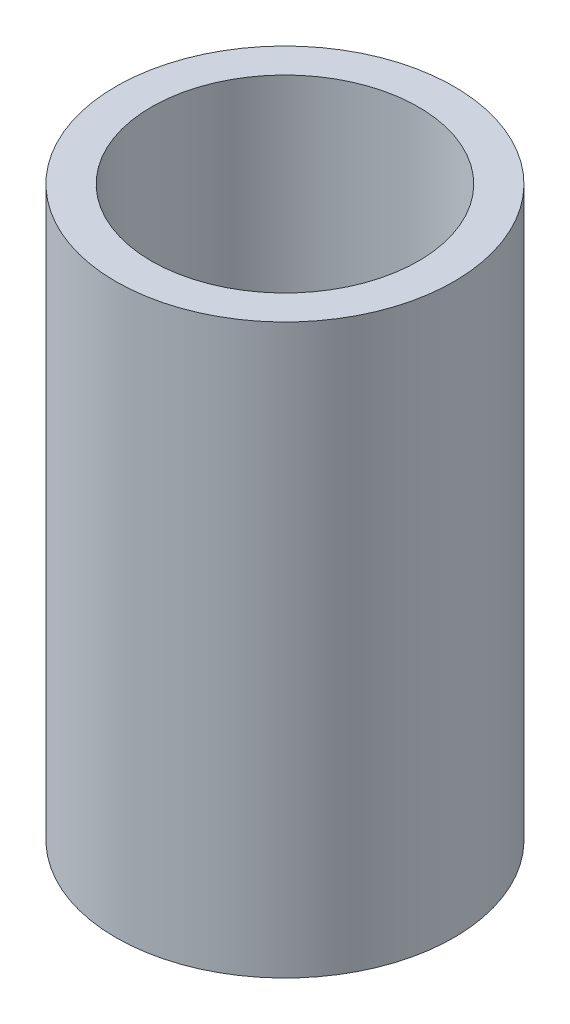
ISO-10303-21;
HEADER;
FILE_DESCRIPTION(('STEP AP214'),'2;1');
FILE_NAME('part.step','',(''),(''),'','','');
FILE_SCHEMA(('AUTOMOTIVE_DESIGN { 1 0 10303 214 1 1 1 1 }'));
ENDSEC;
DATA;
#1=APPLICATION_CONTEXT('core data for automotive mechanical design processes');
#2=APPLICATION_PROTOCOL_DEFINITION('international standard','automotive_design',2000,#1);
#3=PRODUCT_CONTEXT('',#1,'mechanical');
#4=PRODUCT('Part','Part','',(#3));
#5=PRODUCT_RELATED_PRODUCT_CATEGORY('part','',(#4));
#6=PRODUCT_DEFINITION_FORMATION('','',#4);
#7=PRODUCT_DEFINITION_CONTEXT('part definition',#1,'design');
#8=PRODUCT_DEFINITION('design','',#6,#7);
#9=PRODUCT_DEFINITION_SHAPE('','',#8);
#10=(LENGTH_UNIT() NAMED_UNIT(*) SI_UNIT(.MILLI.,.METRE.));
#11=(NAMED_UNIT(*) PLANE_ANGLE_UNIT() SI_UNIT($,.RADIAN.));
#12=(NAMED_UNIT(*) SI_UNIT($,.STERADIAN.) SOLID_ANGLE_UNIT());
#13=UNCERTAINTY_MEASURE_WITH_UNIT(LENGTH_MEASURE(1.E-05),#10,'distance_accuracy_value','');
#14=(GEOMETRIC_REPRESENTATION_CONTEXT(3) GLOBAL_UNCERTAINTY_ASSIGNED_CONTEXT((#13)) GLOBAL_UNIT_ASSIGNED_CONTEXT((#10,
#11,#12)) REPRESENTATION_CONTEXT('',''));
#15=CARTESIAN_POINT('',(0.,0.,0.));
#16=DIRECTION('',(0.,0.,1.));
#17=DIRECTION('',(1.,0.,0.));
#18=AXIS2_PLACEMENT_3D('',#15,#16,#17);
#19=CARTESIAN_POINT('',(0.,10.16,0.));
#20=DIRECTION('',(0.,1.,0.));
#21=DIRECTION('',(0.,0.,1.));
#22=AXIS2_PLACEMENT_3D('',#19,#20,#21);
#23=PLANE('',#22);
#24=CARTESIAN_POINT('',(0.,10.16,0.));
#25=DIRECTION('',(0.,1.,0.));
#26=DIRECTION('',(0.,0.,1.));
#27=AXIS2_PLACEMENT_3D('',#24,#25,#26);
#28=CIRCLE('',#27,3.0226);
#29=CARTESIAN_POINT('',(0.,10.16,3.0226));
#30=VERTEX_POINT('',#29);
#31=EDGE_CURVE('E10',#30,#30,#28,.T.);
#32=ORIENTED_EDGE('',*,*,#31,.T.);
#33=EDGE_LOOP('',(#32));
#34=FACE_BOUND('',#33,.T.);
#35=CARTESIAN_POINT('',(0.,10.16,0.));
#36=DIRECTION('',(0.,1.,0.));
#37=DIRECTION('',(0.,0.,1.));
#38=AXIS2_PLACEMENT_3D('',#35,#36,#37);
#39=CIRCLE('',#38,2.3876);
#40=CARTESIAN_POINT('',(0.,10.16,2.3876));
#41=VERTEX_POINT('',#40);
#42=EDGE_CURVE('E43',#41,#41,#39,.T.);
#43=ORIENTED_EDGE('',*,*,#42,.F.);
#44=EDGE_LOOP('',(#43));
#45=FACE_BOUND('',#44,.T.);
#46=ADVANCED_FACE('F32',(#34,#45),#23,.T.);
#47=CARTESIAN_POINT('',(0.,0.,0.));
#48=DIRECTION('',(0.,1.,0.));
#49=DIRECTION('',(0.,0.,1.));
#50=AXIS2_PLACEMENT_3D('',#47,#48,#49);
#51=PLANE('',#50);
#52=CARTESIAN_POINT('',(0.,0.,0.));
#53=DIRECTION('',(0.,1.,0.));
#54=DIRECTION('',(0.,0.,1.));
#55=AXIS2_PLACEMENT_3D('',#52,#53,#54);
#56=CIRCLE('',#55,3.0226);
#57=CARTESIAN_POINT('',(0.,0.,3.0226));
#58=VERTEX_POINT('',#57);
#59=EDGE_CURVE('E36',#58,#58,#56,.T.);
#60=ORIENTED_EDGE('',*,*,#59,.F.);
#61=EDGE_LOOP('',(#60));
#62=FACE_BOUND('',#61,.T.);
#63=CARTESIAN_POINT('',(0.,0.,0.));
#64=DIRECTION('',(0.,1.,0.));
#65=DIRECTION('',(0.,0.,1.));
#66=AXIS2_PLACEMENT_3D('',#63,#64,#65);
#67=CIRCLE('',#66,2.3876);
#68=CARTESIAN_POINT('',(0.,0.,2.3876));
#69=VERTEX_POINT('',#68);
#70=EDGE_CURVE('E45',#69,#69,#67,.T.);
#71=ORIENTED_EDGE('',*,*,#70,.T.);
#72=EDGE_LOOP('',(#71));
#73=FACE_BOUND('',#72,.T.);
#74=ADVANCED_FACE('F55',(#62,#73),#51,.F.);
#75=CARTESIAN_POINT('',(0.,10.16,0.));
#76=DIRECTION('',(0.,-1.,0.));
#77=DIRECTION('',(0.,0.,-1.));
#78=AXIS2_PLACEMENT_3D('',#75,#76,#77);
#79=CYLINDRICAL_SURFACE('',#78,3.0226);
#80=ORIENTED_EDGE('',*,*,#31,.F.);
#81=EDGE_LOOP('',(#80));
#82=FACE_BOUND('',#81,.T.);
#83=ORIENTED_EDGE('',*,*,#59,.T.);
#84=EDGE_LOOP('',(#83));
#85=FACE_BOUND('',#84,.T.);
#86=ADVANCED_FACE('F34',(#82,#85),#79,.T.);
#87=CARTESIAN_POINT('',(0.,10.16,0.));
#88=DIRECTION('',(0.,-1.,0.));
#89=DIRECTION('',(0.,0.,-1.));
#90=AXIS2_PLACEMENT_3D('',#87,#88,#89);
#91=CYLINDRICAL_SURFACE('',#90,2.3876);
#92=ORIENTED_EDGE('',*,*,#42,.T.);
#93=EDGE_LOOP('',(#92));
#94=FACE_BOUND('',#93,.T.);
#95=ORIENTED_EDGE('',*,*,#70,.F.);
#96=EDGE_LOOP('',(#95));
#97=FACE_BOUND('',#96,.T.);
#98=ADVANCED_FACE('F51',(#94,#97),#91,.F.);
#99=CLOSED_SHELL('',(#46,#74,#86,#98));
#100=MANIFOLD_SOLID_BREP('B2',#99);
#101=ADVANCED_BREP_SHAPE_REPRESENTATION('',(#18,#100),#14);
#102=SHAPE_DEFINITION_REPRESENTATION(#9,#101);
ENDSEC;
END-ISO-10303-21;
